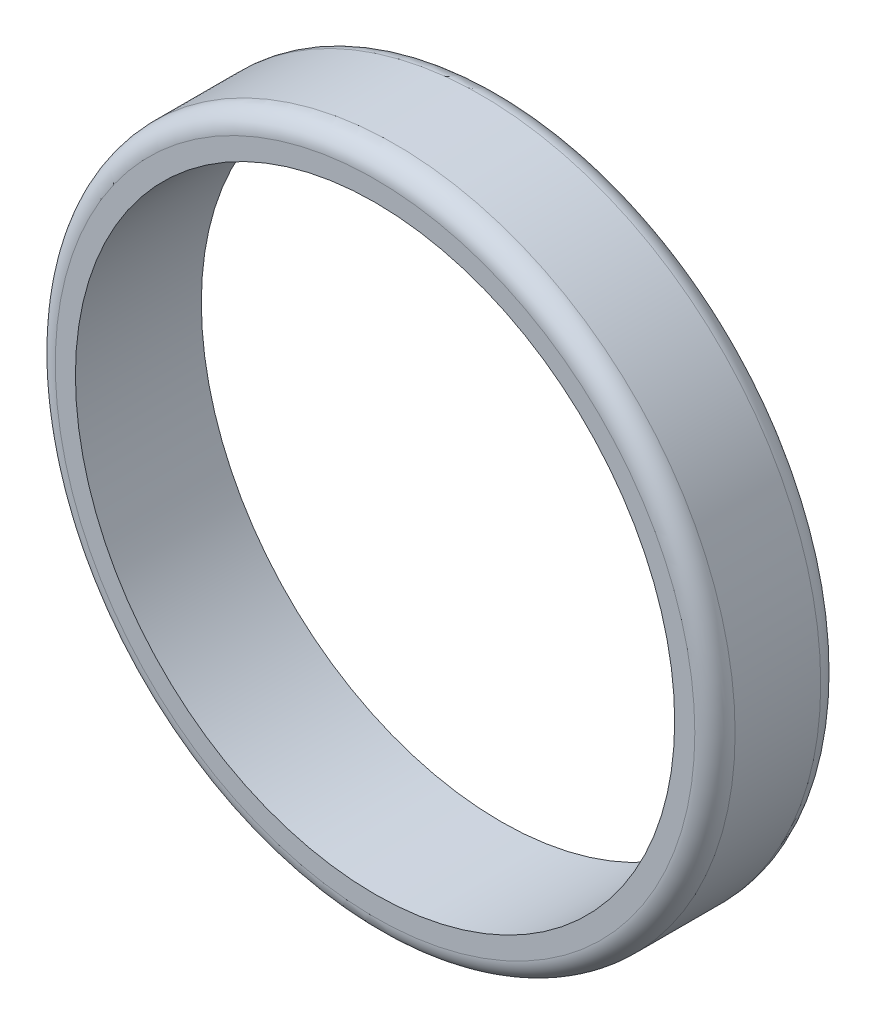
ISO-10303-21;
HEADER;
FILE_DESCRIPTION(('STEP AP214'),'2;1');
FILE_NAME('part.step','',(''),(''),'','','');
FILE_SCHEMA(('AUTOMOTIVE_DESIGN { 1 0 10303 214 1 1 1 1 }'));
ENDSEC;
DATA;
#1=APPLICATION_CONTEXT('core data for automotive mechanical design processes');
#2=APPLICATION_PROTOCOL_DEFINITION('international standard','automotive_design',2000,#1);
#3=PRODUCT_CONTEXT('',#1,'mechanical');
#4=PRODUCT('Part','Part','',(#3));
#5=PRODUCT_RELATED_PRODUCT_CATEGORY('part','',(#4));
#6=PRODUCT_DEFINITION_FORMATION('','',#4);
#7=PRODUCT_DEFINITION_CONTEXT('part definition',#1,'design');
#8=PRODUCT_DEFINITION('design','',#6,#7);
#9=PRODUCT_DEFINITION_SHAPE('','',#8);
#10=(LENGTH_UNIT() NAMED_UNIT(*) SI_UNIT(.MILLI.,.METRE.));
#11=(NAMED_UNIT(*) PLANE_ANGLE_UNIT() SI_UNIT($,.RADIAN.));
#12=(NAMED_UNIT(*) SI_UNIT($,.STERADIAN.) SOLID_ANGLE_UNIT());
#13=UNCERTAINTY_MEASURE_WITH_UNIT(LENGTH_MEASURE(1.E-05),#10,'distance_accuracy_value','');
#14=(GEOMETRIC_REPRESENTATION_CONTEXT(3) GLOBAL_UNCERTAINTY_ASSIGNED_CONTEXT((#13)) GLOBAL_UNIT_ASSIGNED_CONTEXT((#10,
#11,#12)) REPRESENTATION_CONTEXT('',''));
#15=CARTESIAN_POINT('',(0.,0.,0.));
#16=DIRECTION('',(0.,0.,1.));
#17=DIRECTION('',(1.,0.,0.));
#18=AXIS2_PLACEMENT_3D('',#15,#16,#17);
#19=CARTESIAN_POINT('',(0.,0.,25.));
#20=DIRECTION('',(0.,0.,1.));
#21=DIRECTION('',(1.,0.,0.));
#22=AXIS2_PLACEMENT_3D('',#19,#20,#21);
#23=PLANE('',#22);
#24=CARTESIAN_POINT('',(0.,0.,25.));
#25=DIRECTION('',(0.,0.,1.));
#26=DIRECTION('',(1.,0.,0.));
#27=AXIS2_PLACEMENT_3D('',#24,#25,#26);
#28=CIRCLE('',#27,63.5);
#29=CARTESIAN_POINT('',(63.5,0.,25.));
#30=VERTEX_POINT('',#29);
#31=EDGE_CURVE('E10',#30,#30,#28,.T.);
#32=ORIENTED_EDGE('',*,*,#31,.T.);
#33=EDGE_LOOP('',(#32));
#34=FACE_BOUND('',#33,.T.);
#35=CARTESIAN_POINT('',(0.,0.,25.));
#36=DIRECTION('',(0.,0.,1.));
#37=DIRECTION('',(1.,0.,0.));
#38=AXIS2_PLACEMENT_3D('',#35,#36,#37);
#39=CIRCLE('',#38,59.5);
#40=CARTESIAN_POINT('',(59.5,0.,25.));
#41=VERTEX_POINT('',#40);
#42=EDGE_CURVE('E61',#41,#41,#39,.T.);
#43=ORIENTED_EDGE('',*,*,#42,.F.);
#44=EDGE_LOOP('',(#43));
#45=FACE_BOUND('',#44,.T.);
#46=ADVANCED_FACE('F41',(#34,#45),#23,.T.);
#47=CARTESIAN_POINT('',(0.,0.,0.));
#48=DIRECTION('',(0.,0.,1.));
#49=DIRECTION('',(1.,0.,0.));
#50=AXIS2_PLACEMENT_3D('',#47,#48,#49);
#51=PLANE('',#50);
#52=CARTESIAN_POINT('',(0.,0.,0.));
#53=DIRECTION('',(0.,0.,1.));
#54=DIRECTION('',(1.,0.,0.));
#55=AXIS2_PLACEMENT_3D('',#52,#53,#54);
#56=CIRCLE('',#55,63.5);
#57=CARTESIAN_POINT('',(63.5,0.,0.));
#58=VERTEX_POINT('',#57);
#59=EDGE_CURVE('E48',#58,#58,#56,.F.);
#60=ORIENTED_EDGE('',*,*,#59,.T.);
#61=EDGE_LOOP('',(#60));
#62=FACE_BOUND('',#61,.T.);
#63=CARTESIAN_POINT('',(0.,0.,0.));
#64=DIRECTION('',(0.,0.,1.));
#65=DIRECTION('',(1.,0.,0.));
#66=AXIS2_PLACEMENT_3D('',#63,#64,#65);
#67=CIRCLE('',#66,59.5);
#68=CARTESIAN_POINT('',(59.5,0.,0.));
#69=VERTEX_POINT('',#68);
#70=EDGE_CURVE('E62',#69,#69,#67,.T.);
#71=ORIENTED_EDGE('',*,*,#70,.T.);
#72=EDGE_LOOP('',(#71));
#73=FACE_BOUND('',#72,.T.);
#74=ADVANCED_FACE('F72',(#62,#73),#51,.F.);
#75=CARTESIAN_POINT('',(0.,0.,25.));
#76=DIRECTION('',(0.,0.,-1.));
#77=DIRECTION('',(-1.,0.,0.));
#78=AXIS2_PLACEMENT_3D('',#75,#76,#77);
#79=CYLINDRICAL_SURFACE('',#78,67.5);
#80=CARTESIAN_POINT('',(0.,0.,4.));
#81=DIRECTION('',(0.,0.,1.));
#82=DIRECTION('',(1.,0.,0.));
#83=AXIS2_PLACEMENT_3D('',#80,#81,#82);
#84=CIRCLE('',#83,67.5);
#85=CARTESIAN_POINT('',(67.5,0.,4.));
#86=VERTEX_POINT('',#85);
#87=EDGE_CURVE('E52',#86,#86,#84,.T.);
#88=ORIENTED_EDGE('',*,*,#87,.T.);
#89=EDGE_LOOP('',(#88));
#90=FACE_BOUND('',#89,.T.);
#91=CARTESIAN_POINT('',(0.,0.,21.));
#92=DIRECTION('',(0.,0.,1.));
#93=DIRECTION('',(1.,0.,0.));
#94=AXIS2_PLACEMENT_3D('',#91,#92,#93);
#95=CIRCLE('',#94,67.5);
#96=CARTESIAN_POINT('',(67.5,0.,21.));
#97=VERTEX_POINT('',#96);
#98=EDGE_CURVE('E56',#97,#97,#95,.F.);
#99=ORIENTED_EDGE('',*,*,#98,.T.);
#100=EDGE_LOOP('',(#99));
#101=FACE_BOUND('',#100,.T.);
#102=ADVANCED_FACE('F78',(#90,#101),#79,.T.);
#103=CARTESIAN_POINT('',(0.,0.,25.));
#104=DIRECTION('',(0.,0.,-1.));
#105=DIRECTION('',(-1.,0.,0.));
#106=AXIS2_PLACEMENT_3D('',#103,#104,#105);
#107=CYLINDRICAL_SURFACE('',#106,59.5);
#108=ORIENTED_EDGE('',*,*,#42,.T.);
#109=EDGE_LOOP('',(#108));
#110=FACE_BOUND('',#109,.T.);
#111=ORIENTED_EDGE('',*,*,#70,.F.);
#112=EDGE_LOOP('',(#111));
#113=FACE_BOUND('',#112,.T.);
#114=ADVANCED_FACE('F68',(#110,#113),#107,.F.);
#115=CARTESIAN_POINT('',(0.,0.,4.));
#116=DIRECTION('',(0.,0.,1.));
#117=DIRECTION('',(1.,0.,0.));
#118=AXIS2_PLACEMENT_3D('',#115,#116,#117);
#119=TOROIDAL_SURFACE('',#118,63.5,4.);
#120=ORIENTED_EDGE('',*,*,#59,.F.);
#121=EDGE_LOOP('',(#120));
#122=FACE_BOUND('',#121,.T.);
#123=ORIENTED_EDGE('',*,*,#87,.F.);
#124=EDGE_LOOP('',(#123));
#125=FACE_BOUND('',#124,.T.);
#126=ADVANCED_FACE('F84',(#122,#125),#119,.T.);
#127=CARTESIAN_POINT('',(0.,0.,21.));
#128=DIRECTION('',(0.,0.,1.));
#129=DIRECTION('',(1.,0.,0.));
#130=AXIS2_PLACEMENT_3D('',#127,#128,#129);
#131=TOROIDAL_SURFACE('',#130,63.5,4.);
#132=ORIENTED_EDGE('',*,*,#98,.F.);
#133=EDGE_LOOP('',(#132));
#134=FACE_BOUND('',#133,.T.);
#135=ORIENTED_EDGE('',*,*,#31,.F.);
#136=EDGE_LOOP('',(#135));
#137=FACE_BOUND('',#136,.T.);
#138=ADVANCED_FACE('F43',(#134,#137),#131,.T.);
#139=CLOSED_SHELL('',(#46,#74,#102,#114,#126,#138));
#140=MANIFOLD_SOLID_BREP('B2',#139);
#141=ADVANCED_BREP_SHAPE_REPRESENTATION('',(#18,#140),#14);
#142=SHAPE_DEFINITION_REPRESENTATION(#9,#141);
ENDSEC;
END-ISO-10303-21;
